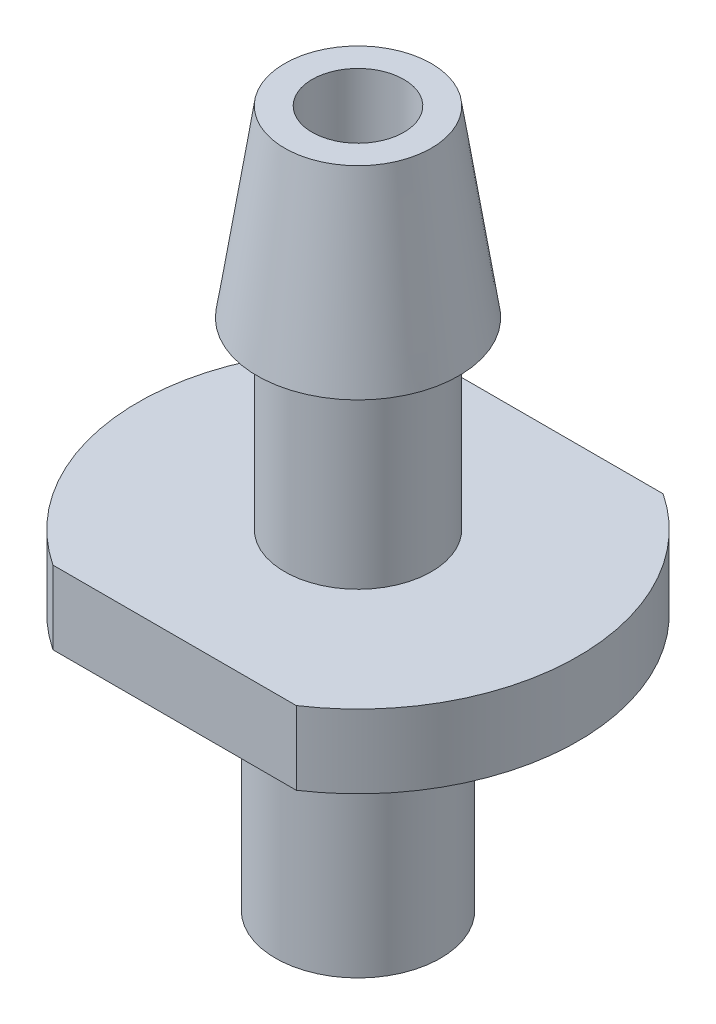
ISO-10303-21;
HEADER;
FILE_DESCRIPTION(('STEP AP214'),'2;1');
FILE_NAME('part.step','',(''),(''),'','','');
FILE_SCHEMA(('AUTOMOTIVE_DESIGN { 1 0 10303 214 1 1 1 1 }'));
ENDSEC;
DATA;
#1=APPLICATION_CONTEXT('core data for automotive mechanical design processes');
#2=APPLICATION_PROTOCOL_DEFINITION('international standard','automotive_design',2000,#1);
#3=PRODUCT_CONTEXT('',#1,'mechanical');
#4=PRODUCT('Part','Part','',(#3));
#5=PRODUCT_RELATED_PRODUCT_CATEGORY('part','',(#4));
#6=PRODUCT_DEFINITION_FORMATION('','',#4);
#7=PRODUCT_DEFINITION_CONTEXT('part definition',#1,'design');
#8=PRODUCT_DEFINITION('design','',#6,#7);
#9=PRODUCT_DEFINITION_SHAPE('','',#8);
#10=(LENGTH_UNIT() NAMED_UNIT(*) SI_UNIT(.MILLI.,.METRE.));
#11=(NAMED_UNIT(*) PLANE_ANGLE_UNIT() SI_UNIT($,.RADIAN.));
#12=(NAMED_UNIT(*) SI_UNIT($,.STERADIAN.) SOLID_ANGLE_UNIT());
#13=UNCERTAINTY_MEASURE_WITH_UNIT(LENGTH_MEASURE(1.E-05),#10,'distance_accuracy_value','');
#14=(GEOMETRIC_REPRESENTATION_CONTEXT(3) GLOBAL_UNCERTAINTY_ASSIGNED_CONTEXT((#13)) GLOBAL_UNIT_ASSIGNED_CONTEXT((#10,
#11,#12)) REPRESENTATION_CONTEXT('',''));
#15=CARTESIAN_POINT('',(0.,0.,0.));
#16=DIRECTION('',(0.,0.,1.));
#17=DIRECTION('',(1.,0.,0.));
#18=AXIS2_PLACEMENT_3D('',#15,#16,#17);
#19=CARTESIAN_POINT('',(0.,0.,0.));
#20=DIRECTION('',(0.,-1.,0.));
#21=DIRECTION('',(0.,0.,-1.));
#22=AXIS2_PLACEMENT_3D('',#19,#20,#21);
#23=CYLINDRICAL_SURFACE('',#22,6.);
#24=CARTESIAN_POINT('',(0.,9.,0.));
#25=DIRECTION('',(0.,-1.,0.));
#26=DIRECTION('',(0.,0.,-1.));
#27=AXIS2_PLACEMENT_3D('',#24,#25,#26);
#28=CIRCLE('',#27,6.);
#29=CARTESIAN_POINT('',(3.31662479035539,9.,-5.));
#30=VERTEX_POINT('',#29);
#31=CARTESIAN_POINT('',(3.3166247903554,9.,5.));
#32=VERTEX_POINT('',#31);
#33=EDGE_CURVE('E84',#30,#32,#28,.T.);
#34=ORIENTED_EDGE('',*,*,#33,.T.);
#35=DIRECTION('',(0.,-1.,0.));
#36=VECTOR('',#35,1.);
#37=CARTESIAN_POINT('',(3.3166247903554,0.,5.));
#38=LINE('',#37,#36);
#39=CARTESIAN_POINT('',(3.3166247903554,7.,5.));
#40=VERTEX_POINT('',#39);
#41=EDGE_CURVE('E58',#32,#40,#38,.T.);
#42=ORIENTED_EDGE('',*,*,#41,.T.);
#43=CARTESIAN_POINT('',(0.,7.,0.));
#44=DIRECTION('',(0.,-1.,0.));
#45=DIRECTION('',(0.,0.,-1.));
#46=AXIS2_PLACEMENT_3D('',#43,#44,#45);
#47=CIRCLE('',#46,6.);
#48=CARTESIAN_POINT('',(3.3166247903554,7.,-5.));
#49=VERTEX_POINT('',#48);
#50=EDGE_CURVE('E86',#49,#40,#47,.T.);
#51=ORIENTED_EDGE('',*,*,#50,.F.);
#52=DIRECTION('',(0.,-1.,0.));
#53=VECTOR('',#52,1.);
#54=CARTESIAN_POINT('',(3.3166247903554,0.,-5.));
#55=LINE('',#54,#53);
#56=EDGE_CURVE('E74',#49,#30,#55,.F.);
#57=ORIENTED_EDGE('',*,*,#56,.T.);
#58=EDGE_LOOP('',(#34,#42,#51,#57));
#59=FACE_BOUND('',#58,.T.);
#60=ADVANCED_FACE('F35',(#59),#23,.T.);
#61=CARTESIAN_POINT('',(0.,0.,0.));
#62=DIRECTION('',(0.,-1.,0.));
#63=DIRECTION('',(0.,0.,-1.));
#64=AXIS2_PLACEMENT_3D('',#61,#62,#63);
#65=CYLINDRICAL_SURFACE('',#64,1.25);
#66=CARTESIAN_POINT('',(0.,19.,0.));
#67=DIRECTION('',(0.,-1.,0.));
#68=DIRECTION('',(0.,0.,-1.));
#69=AXIS2_PLACEMENT_3D('',#66,#67,#68);
#70=CIRCLE('',#69,1.25);
#71=CARTESIAN_POINT('',(0.,19.,-1.25));
#72=VERTEX_POINT('',#71);
#73=EDGE_CURVE('E137',#72,#72,#70,.T.);
#74=ORIENTED_EDGE('',*,*,#73,.F.);
#75=EDGE_LOOP('',(#74));
#76=FACE_BOUND('',#75,.T.);
#77=CARTESIAN_POINT('',(0.,0.,0.));
#78=DIRECTION('',(0.,-1.,0.));
#79=DIRECTION('',(0.,0.,-1.));
#80=AXIS2_PLACEMENT_3D('',#77,#78,#79);
#81=CIRCLE('',#80,1.25);
#82=CARTESIAN_POINT('',(0.,0.,-1.25));
#83=VERTEX_POINT('',#82);
#84=EDGE_CURVE('E80',#83,#83,#81,.T.);
#85=ORIENTED_EDGE('',*,*,#84,.T.);
#86=EDGE_LOOP('',(#85));
#87=FACE_BOUND('',#86,.T.);
#88=ADVANCED_FACE('F37',(#76,#87),#65,.F.);
#89=CARTESIAN_POINT('',(-1.25,0.,0.));
#90=DIRECTION('',(0.,1.,0.));
#91=DIRECTION('',(0.,0.,1.));
#92=AXIS2_PLACEMENT_3D('',#89,#90,#91);
#93=PLANE('',#92);
#94=ORIENTED_EDGE('',*,*,#84,.F.);
#95=EDGE_LOOP('',(#94));
#96=FACE_BOUND('',#95,.T.);
#97=CARTESIAN_POINT('',(0.,0.,0.));
#98=DIRECTION('',(0.,-1.,0.));
#99=DIRECTION('',(0.,0.,-1.));
#100=AXIS2_PLACEMENT_3D('',#97,#98,#99);
#101=CIRCLE('',#100,2.25);
#102=CARTESIAN_POINT('',(0.,0.,-2.25));
#103=VERTEX_POINT('',#102);
#104=EDGE_CURVE('E103',#103,#103,#101,.T.);
#105=ORIENTED_EDGE('',*,*,#104,.T.);
#106=EDGE_LOOP('',(#105));
#107=FACE_BOUND('',#106,.T.);
#108=ADVANCED_FACE('F110',(#96,#107),#93,.F.);
#109=CARTESIAN_POINT('',(0.,0.,0.));
#110=DIRECTION('',(0.,-1.,0.));
#111=DIRECTION('',(0.,0.,-1.));
#112=AXIS2_PLACEMENT_3D('',#109,#110,#111);
#113=CYLINDRICAL_SURFACE('',#112,2.25);
#114=ORIENTED_EDGE('',*,*,#104,.F.);
#115=EDGE_LOOP('',(#114));
#116=FACE_BOUND('',#115,.T.);
#117=CARTESIAN_POINT('',(0.,7.,0.));
#118=DIRECTION('',(0.,-1.,0.));
#119=DIRECTION('',(0.,0.,-1.));
#120=AXIS2_PLACEMENT_3D('',#117,#118,#119);
#121=CIRCLE('',#120,2.25);
#122=CARTESIAN_POINT('',(0.,7.,-2.25));
#123=VERTEX_POINT('',#122);
#124=EDGE_CURVE('E100',#123,#123,#121,.T.);
#125=ORIENTED_EDGE('',*,*,#124,.T.);
#126=EDGE_LOOP('',(#125));
#127=FACE_BOUND('',#126,.T.);
#128=ADVANCED_FACE('F113',(#116,#127),#113,.T.);
#129=CARTESIAN_POINT('',(-2.25,7.,0.));
#130=DIRECTION('',(0.,1.,0.));
#131=DIRECTION('',(0.,0.,1.));
#132=AXIS2_PLACEMENT_3D('',#129,#130,#131);
#133=PLANE('',#132);
#134=ORIENTED_EDGE('',*,*,#124,.F.);
#135=EDGE_LOOP('',(#134));
#136=FACE_BOUND('',#135,.T.);
#137=ORIENTED_EDGE('',*,*,#50,.T.);
#138=DIRECTION('',(-1.,0.,0.));
#139=VECTOR('',#138,1.);
#140=CARTESIAN_POINT('',(-2.25,7.,5.));
#141=LINE('',#140,#139);
#142=CARTESIAN_POINT('',(-3.3166247903554,7.,5.));
#143=VERTEX_POINT('',#142);
#144=EDGE_CURVE('E127',#40,#143,#141,.T.);
#145=ORIENTED_EDGE('',*,*,#144,.T.);
#146=CARTESIAN_POINT('',(-3.3166247903554,7.,-5.));
#147=VERTEX_POINT('',#146);
#148=EDGE_CURVE('E91',#143,#147,#47,.T.);
#149=ORIENTED_EDGE('',*,*,#148,.T.);
#150=DIRECTION('',(1.,0.,0.));
#151=VECTOR('',#150,1.);
#152=CARTESIAN_POINT('',(-2.25,7.,-5.));
#153=LINE('',#152,#151);
#154=EDGE_CURVE('E87',#147,#49,#153,.T.);
#155=ORIENTED_EDGE('',*,*,#154,.T.);
#156=EDGE_LOOP('',(#137,#145,#149,#155));
#157=FACE_BOUND('',#156,.T.);
#158=ADVANCED_FACE('F118',(#136,#157),#133,.F.);
#159=ORIENTED_EDGE('',*,*,#148,.F.);
#160=DIRECTION('',(0.,-1.,0.));
#161=VECTOR('',#160,1.);
#162=CARTESIAN_POINT('',(-3.3166247903554,0.,5.));
#163=LINE('',#162,#161);
#164=CARTESIAN_POINT('',(-3.3166247903554,9.,5.));
#165=VERTEX_POINT('',#164);
#166=EDGE_CURVE('E130',#143,#165,#163,.F.);
#167=ORIENTED_EDGE('',*,*,#166,.T.);
#168=CARTESIAN_POINT('',(-3.3166247903554,9.,-5.));
#169=VERTEX_POINT('',#168);
#170=EDGE_CURVE('E92',#165,#169,#28,.T.);
#171=ORIENTED_EDGE('',*,*,#170,.T.);
#172=DIRECTION('',(0.,-1.,0.));
#173=VECTOR('',#172,1.);
#174=CARTESIAN_POINT('',(-3.3166247903554,0.,-5.));
#175=LINE('',#174,#173);
#176=EDGE_CURVE('E50',#169,#147,#175,.T.);
#177=ORIENTED_EDGE('',*,*,#176,.T.);
#178=EDGE_LOOP('',(#159,#167,#171,#177));
#179=FACE_BOUND('',#178,.T.);
#180=ADVANCED_FACE('F124',(#179),#23,.T.);
#181=CARTESIAN_POINT('',(-6.,9.,0.));
#182=DIRECTION('',(0.,-1.,0.));
#183=DIRECTION('',(0.,0.,-1.));
#184=AXIS2_PLACEMENT_3D('',#181,#182,#183);
#185=PLANE('',#184);
#186=ORIENTED_EDGE('',*,*,#170,.F.);
#187=DIRECTION('',(1.,0.,0.));
#188=VECTOR('',#187,1.);
#189=CARTESIAN_POINT('',(-6.,9.,5.));
#190=LINE('',#189,#188);
#191=EDGE_CURVE('E11',#165,#32,#190,.T.);
#192=ORIENTED_EDGE('',*,*,#191,.T.);
#193=ORIENTED_EDGE('',*,*,#33,.F.);
#194=DIRECTION('',(-1.,0.,0.));
#195=VECTOR('',#194,1.);
#196=CARTESIAN_POINT('',(-6.,9.,-5.));
#197=LINE('',#196,#195);
#198=EDGE_CURVE('E43',#30,#169,#197,.T.);
#199=ORIENTED_EDGE('',*,*,#198,.T.);
#200=EDGE_LOOP('',(#186,#192,#193,#199));
#201=FACE_BOUND('',#200,.T.);
#202=CARTESIAN_POINT('',(0.,9.,0.));
#203=DIRECTION('',(0.,-1.,0.));
#204=DIRECTION('',(0.,0.,-1.));
#205=AXIS2_PLACEMENT_3D('',#202,#203,#204);
#206=CIRCLE('',#205,2.);
#207=CARTESIAN_POINT('',(0.,9.,-2.));
#208=VERTEX_POINT('',#207);
#209=EDGE_CURVE('E96',#208,#208,#206,.T.);
#210=ORIENTED_EDGE('',*,*,#209,.T.);
#211=EDGE_LOOP('',(#210));
#212=FACE_BOUND('',#211,.T.);
#213=ADVANCED_FACE('F89',(#201,#212),#185,.F.);
#214=CARTESIAN_POINT('',(0.,0.,0.));
#215=DIRECTION('',(0.,-1.,0.));
#216=DIRECTION('',(0.,0.,-1.));
#217=AXIS2_PLACEMENT_3D('',#214,#215,#216);
#218=CYLINDRICAL_SURFACE('',#217,2.);
#219=ORIENTED_EDGE('',*,*,#209,.F.);
#220=EDGE_LOOP('',(#219));
#221=FACE_BOUND('',#220,.T.);
#222=CARTESIAN_POINT('',(0.,14.,0.));
#223=DIRECTION('',(0.,-1.,0.));
#224=DIRECTION('',(0.,0.,-1.));
#225=AXIS2_PLACEMENT_3D('',#222,#223,#224);
#226=CIRCLE('',#225,2.);
#227=CARTESIAN_POINT('',(0.,14.,-2.));
#228=VERTEX_POINT('',#227);
#229=EDGE_CURVE('E145',#228,#228,#226,.T.);
#230=ORIENTED_EDGE('',*,*,#229,.T.);
#231=EDGE_LOOP('',(#230));
#232=FACE_BOUND('',#231,.T.);
#233=ADVANCED_FACE('F152',(#221,#232),#218,.T.);
#234=CARTESIAN_POINT('',(-2.,14.,0.));
#235=DIRECTION('',(0.,1.,0.));
#236=DIRECTION('',(0.,0.,1.));
#237=AXIS2_PLACEMENT_3D('',#234,#235,#236);
#238=PLANE('',#237);
#239=ORIENTED_EDGE('',*,*,#229,.F.);
#240=EDGE_LOOP('',(#239));
#241=FACE_BOUND('',#240,.T.);
#242=CARTESIAN_POINT('',(0.,14.,0.));
#243=DIRECTION('',(0.,-1.,0.));
#244=DIRECTION('',(0.,0.,-1.));
#245=AXIS2_PLACEMENT_3D('',#242,#243,#244);
#246=CIRCLE('',#245,2.75);
#247=CARTESIAN_POINT('',(0.,14.,-2.75));
#248=VERTEX_POINT('',#247);
#249=EDGE_CURVE('E143',#248,#248,#246,.T.);
#250=ORIENTED_EDGE('',*,*,#249,.T.);
#251=EDGE_LOOP('',(#250));
#252=FACE_BOUND('',#251,.T.);
#253=ADVANCED_FACE('F154',(#241,#252),#238,.F.);
#254=CARTESIAN_POINT('',(0.,19.,0.));
#255=DIRECTION('',(0.,-1.,0.));
#256=DIRECTION('',(0.,0.,-1.));
#257=AXIS2_PLACEMENT_3D('',#254,#255,#256);
#258=CONICAL_SURFACE('',#257,2.,0.148889947609497);
#259=ORIENTED_EDGE('',*,*,#249,.F.);
#260=EDGE_LOOP('',(#259));
#261=FACE_BOUND('',#260,.T.);
#262=CARTESIAN_POINT('',(0.,19.,0.));
#263=DIRECTION('',(0.,-1.,0.));
#264=DIRECTION('',(0.,0.,-1.));
#265=AXIS2_PLACEMENT_3D('',#262,#263,#264);
#266=CIRCLE('',#265,2.);
#267=CARTESIAN_POINT('',(0.,19.,-2.));
#268=VERTEX_POINT('',#267);
#269=EDGE_CURVE('E140',#268,#268,#266,.T.);
#270=ORIENTED_EDGE('',*,*,#269,.T.);
#271=EDGE_LOOP('',(#270));
#272=FACE_BOUND('',#271,.T.);
#273=ADVANCED_FACE('F160',(#261,#272),#258,.T.);
#274=CARTESIAN_POINT('',(-2.,19.,0.));
#275=DIRECTION('',(0.,-1.,0.));
#276=DIRECTION('',(0.,0.,-1.));
#277=AXIS2_PLACEMENT_3D('',#274,#275,#276);
#278=PLANE('',#277);
#279=ORIENTED_EDGE('',*,*,#269,.F.);
#280=EDGE_LOOP('',(#279));
#281=FACE_BOUND('',#280,.T.);
#282=ORIENTED_EDGE('',*,*,#73,.T.);
#283=EDGE_LOOP('',(#282));
#284=FACE_BOUND('',#283,.T.);
#285=ADVANCED_FACE('F180',(#281,#284),#278,.F.);
#286=CARTESIAN_POINT('',(-5.90175109872114,-1.,-5.));
#287=DIRECTION('',(0.,0.,1.));
#288=DIRECTION('',(1.,0.,0.));
#289=AXIS2_PLACEMENT_3D('',#286,#287,#288);
#290=PLANE('',#289);
#291=ORIENTED_EDGE('',*,*,#198,.F.);
#292=ORIENTED_EDGE('',*,*,#56,.F.);
#293=ORIENTED_EDGE('',*,*,#154,.F.);
#294=ORIENTED_EDGE('',*,*,#176,.F.);
#295=EDGE_LOOP('',(#291,#292,#293,#294));
#296=FACE_BOUND('',#295,.T.);
#297=ADVANCED_FACE('F73',(#296),#290,.F.);
#298=CARTESIAN_POINT('',(-5.90175109872114,-1.,5.));
#299=DIRECTION('',(0.,0.,-1.));
#300=DIRECTION('',(-1.,0.,0.));
#301=AXIS2_PLACEMENT_3D('',#298,#299,#300);
#302=PLANE('',#301);
#303=ORIENTED_EDGE('',*,*,#191,.F.);
#304=ORIENTED_EDGE('',*,*,#166,.F.);
#305=ORIENTED_EDGE('',*,*,#144,.F.);
#306=ORIENTED_EDGE('',*,*,#41,.F.);
#307=EDGE_LOOP('',(#303,#304,#305,#306));
#308=FACE_BOUND('',#307,.T.);
#309=ADVANCED_FACE('F174',(#308),#302,.F.);
#310=CLOSED_SHELL('',(#60,#88,#108,#128,#158,#180,#213,#233,#253,#273,#285,#297,#309));
#311=MANIFOLD_SOLID_BREP('B2',#310);
#312=ADVANCED_BREP_SHAPE_REPRESENTATION('',(#18,#311),#14);
#313=SHAPE_DEFINITION_REPRESENTATION(#9,#312);
ENDSEC;
END-ISO-10303-21;
